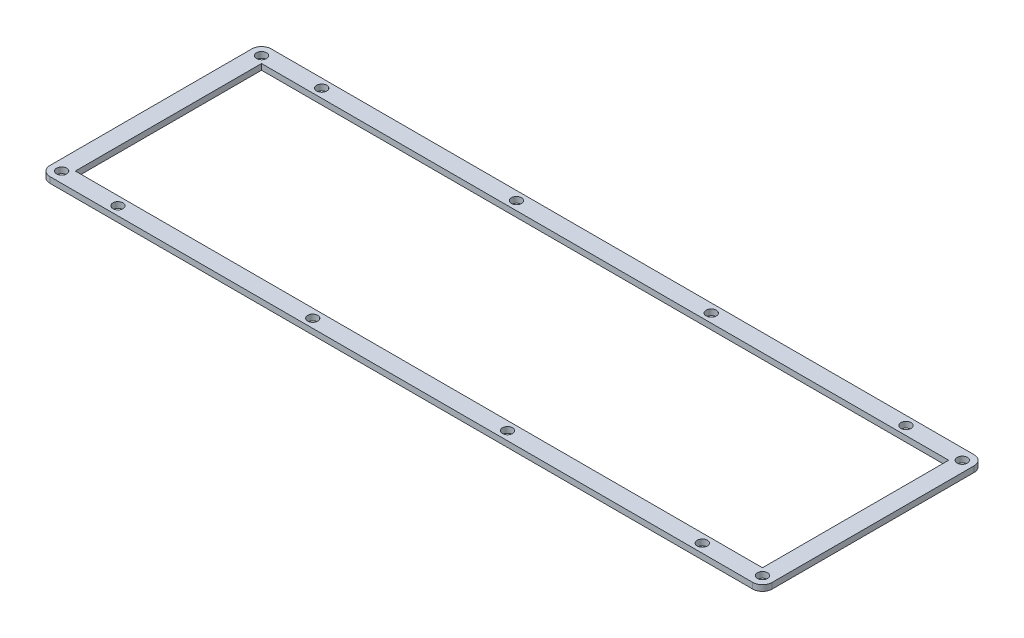
ISO-10303-21;
HEADER;
FILE_DESCRIPTION(('STEP AP214'),'2;1');
FILE_NAME('part.step','',(''),(''),'','','');
FILE_SCHEMA(('AUTOMOTIVE_DESIGN { 1 0 10303 214 1 1 1 1 }'));
ENDSEC;
DATA;
#1=APPLICATION_CONTEXT('core data for automotive mechanical design processes');
#2=APPLICATION_PROTOCOL_DEFINITION('international standard','automotive_design',2000,#1);
#3=PRODUCT_CONTEXT('',#1,'mechanical');
#4=PRODUCT('Part','Part','',(#3));
#5=PRODUCT_RELATED_PRODUCT_CATEGORY('part','',(#4));
#6=PRODUCT_DEFINITION_FORMATION('','',#4);
#7=PRODUCT_DEFINITION_CONTEXT('part definition',#1,'design');
#8=PRODUCT_DEFINITION('design','',#6,#7);
#9=PRODUCT_DEFINITION_SHAPE('','',#8);
#10=(LENGTH_UNIT() NAMED_UNIT(*) SI_UNIT(.MILLI.,.METRE.));
#11=(NAMED_UNIT(*) PLANE_ANGLE_UNIT() SI_UNIT($,.RADIAN.));
#12=(NAMED_UNIT(*) SI_UNIT($,.STERADIAN.) SOLID_ANGLE_UNIT());
#13=UNCERTAINTY_MEASURE_WITH_UNIT(LENGTH_MEASURE(1.E-05),#10,'distance_accuracy_value','');
#14=(GEOMETRIC_REPRESENTATION_CONTEXT(3) GLOBAL_UNCERTAINTY_ASSIGNED_CONTEXT((#13)) GLOBAL_UNIT_ASSIGNED_CONTEXT((#10,
#11,#12)) REPRESENTATION_CONTEXT('',''));
#15=CARTESIAN_POINT('',(0.,0.,0.));
#16=DIRECTION('',(0.,0.,1.));
#17=DIRECTION('',(1.,0.,0.));
#18=AXIS2_PLACEMENT_3D('',#15,#16,#17);
#19=CARTESIAN_POINT('',(365.775004973282,-3.,-4.9999980071498));
#20=DIRECTION('',(0.,1.,0.));
#21=DIRECTION('',(0.,0.,1.));
#22=AXIS2_PLACEMENT_3D('',#19,#20,#21);
#23=CYLINDRICAL_SURFACE('',#22,5.);
#24=CARTESIAN_POINT('',(365.775004973282,0.,-4.9999980071498));
#25=DIRECTION('',(0.,1.,0.));
#26=DIRECTION('',(0.,0.,1.));
#27=AXIS2_PLACEMENT_3D('',#24,#25,#26);
#28=CIRCLE('',#27,5.);
#29=CARTESIAN_POINT('',(365.775004973282,0.,1.99285020219264E-06));
#30=VERTEX_POINT('',#29);
#31=CARTESIAN_POINT('',(370.775004973282,0.,-4.99999800715037));
#32=VERTEX_POINT('',#31);
#33=EDGE_CURVE('E184',#30,#32,#28,.T.);
#34=ORIENTED_EDGE('',*,*,#33,.F.);
#35=DIRECTION('',(0.,1.,0.));
#36=VECTOR('',#35,1.);
#37=CARTESIAN_POINT('',(365.775004973282,-3.,1.99285020219264E-06));
#38=LINE('',#37,#36);
#39=CARTESIAN_POINT('',(365.775004973282,-3.,1.99285020219264E-06));
#40=VERTEX_POINT('',#39);
#41=EDGE_CURVE('E11',#40,#30,#38,.T.);
#42=ORIENTED_EDGE('',*,*,#41,.F.);
#43=CARTESIAN_POINT('',(365.775004973282,-3.,-4.9999980071498));
#44=DIRECTION('',(0.,1.,0.));
#45=DIRECTION('',(0.,0.,1.));
#46=AXIS2_PLACEMENT_3D('',#43,#44,#45);
#47=CIRCLE('',#46,5.);
#48=CARTESIAN_POINT('',(370.775004973282,-3.,-4.99999800715037));
#49=VERTEX_POINT('',#48);
#50=EDGE_CURVE('E187',#40,#49,#47,.T.);
#51=ORIENTED_EDGE('',*,*,#50,.T.);
#52=DIRECTION('',(0.,1.,0.));
#53=VECTOR('',#52,1.);
#54=CARTESIAN_POINT('',(370.775004973282,-3.,-4.99999800715037));
#55=LINE('',#54,#53);
#56=EDGE_CURVE('E36',#49,#32,#55,.T.);
#57=ORIENTED_EDGE('',*,*,#56,.T.);
#58=EDGE_LOOP('',(#34,#42,#51,#57));
#59=FACE_BOUND('',#58,.T.);
#60=ADVANCED_FACE('F33',(#59),#23,.T.);
#61=CARTESIAN_POINT('',(365.775004973282,-3.,1.99285020219264E-06));
#62=DIRECTION('',(0.,0.,1.));
#63=DIRECTION('',(1.,0.,0.));
#64=AXIS2_PLACEMENT_3D('',#61,#62,#63);
#65=PLANE('',#64);
#66=DIRECTION('',(1.,0.,0.));
#67=VECTOR('',#66,1.);
#68=CARTESIAN_POINT('',(365.775004973282,0.,1.99285020219264E-06));
#69=LINE('',#68,#67);
#70=CARTESIAN_POINT('',(5.00000497329483,0.,1.99284960533674E-06));
#71=VERTEX_POINT('',#70);
#72=EDGE_CURVE('E191',#71,#30,#69,.T.);
#73=ORIENTED_EDGE('',*,*,#72,.F.);
#74=DIRECTION('',(0.,1.,0.));
#75=VECTOR('',#74,1.);
#76=CARTESIAN_POINT('',(5.00000497329483,-3.,1.99284960533674E-06));
#77=LINE('',#76,#75);
#78=CARTESIAN_POINT('',(5.00000497329483,-3.,1.99284960533674E-06));
#79=VERTEX_POINT('',#78);
#80=EDGE_CURVE('E41',#79,#71,#77,.T.);
#81=ORIENTED_EDGE('',*,*,#80,.F.);
#82=DIRECTION('',(1.,0.,0.));
#83=VECTOR('',#82,1.);
#84=CARTESIAN_POINT('',(365.775004973282,-3.,1.99285020219264E-06));
#85=LINE('',#84,#83);
#86=EDGE_CURVE('E209',#79,#40,#85,.T.);
#87=ORIENTED_EDGE('',*,*,#86,.T.);
#88=ORIENTED_EDGE('',*,*,#41,.T.);
#89=EDGE_LOOP('',(#73,#81,#87,#88));
#90=FACE_BOUND('',#89,.T.);
#91=ADVANCED_FACE('F256',(#90),#65,.T.);
#92=CARTESIAN_POINT('',(5.00000497329484,-3.,-4.9999980071504));
#93=DIRECTION('',(0.,1.,0.));
#94=DIRECTION('',(0.,0.,1.));
#95=AXIS2_PLACEMENT_3D('',#92,#93,#94);
#96=CYLINDRICAL_SURFACE('',#95,5.);
#97=CARTESIAN_POINT('',(5.00000497329484,0.,-4.9999980071504));
#98=DIRECTION('',(0.,1.,0.));
#99=DIRECTION('',(0.,0.,1.));
#100=AXIS2_PLACEMENT_3D('',#97,#98,#99);
#101=CIRCLE('',#100,5.);
#102=CARTESIAN_POINT('',(4.97329483498121E-06,0.,-4.9999980071504));
#103=VERTEX_POINT('',#102);
#104=EDGE_CURVE('E229',#103,#71,#101,.T.);
#105=ORIENTED_EDGE('',*,*,#104,.F.);
#106=DIRECTION('',(0.,1.,0.));
#107=VECTOR('',#106,1.);
#108=CARTESIAN_POINT('',(4.97329483498121E-06,-3.,-4.9999980071504));
#109=LINE('',#108,#107);
#110=CARTESIAN_POINT('',(4.97329483498121E-06,-3.,-4.9999980071504));
#111=VERTEX_POINT('',#110);
#112=EDGE_CURVE('E235',#111,#103,#109,.T.);
#113=ORIENTED_EDGE('',*,*,#112,.F.);
#114=CARTESIAN_POINT('',(5.00000497329484,-3.,-4.9999980071504));
#115=DIRECTION('',(0.,1.,0.));
#116=DIRECTION('',(0.,0.,1.));
#117=AXIS2_PLACEMENT_3D('',#114,#115,#116);
#118=CIRCLE('',#117,5.);
#119=EDGE_CURVE('E206',#111,#79,#118,.T.);
#120=ORIENTED_EDGE('',*,*,#119,.T.);
#121=ORIENTED_EDGE('',*,*,#80,.T.);
#122=EDGE_LOOP('',(#105,#113,#120,#121));
#123=FACE_BOUND('',#122,.T.);
#124=ADVANCED_FACE('F276',(#123),#96,.T.);
#125=CARTESIAN_POINT('',(4.97329483462039E-06,-3.,-108.599998007137));
#126=DIRECTION('',(-1.,0.,0.));
#127=DIRECTION('',(0.,0.,1.));
#128=AXIS2_PLACEMENT_3D('',#125,#126,#127);
#129=PLANE('',#128);
#130=DIRECTION('',(0.,0.,1.));
#131=VECTOR('',#130,1.);
#132=CARTESIAN_POINT('',(4.97329483462039E-06,0.,-108.599998007137));
#133=LINE('',#132,#131);
#134=CARTESIAN_POINT('',(4.97329483462039E-06,0.,-108.599998007137));
#135=VERTEX_POINT('',#134);
#136=EDGE_CURVE('E226',#135,#103,#133,.T.);
#137=ORIENTED_EDGE('',*,*,#136,.F.);
#138=DIRECTION('',(0.,1.,0.));
#139=VECTOR('',#138,1.);
#140=CARTESIAN_POINT('',(4.97329483462039E-06,-3.,-108.599998007137));
#141=LINE('',#140,#139);
#142=CARTESIAN_POINT('',(4.97329483462039E-06,-3.,-108.599998007137));
#143=VERTEX_POINT('',#142);
#144=EDGE_CURVE('E237',#143,#135,#141,.T.);
#145=ORIENTED_EDGE('',*,*,#144,.F.);
#146=DIRECTION('',(0.,0.,1.));
#147=VECTOR('',#146,1.);
#148=CARTESIAN_POINT('',(4.97329483462039E-06,-3.,-108.599998007137));
#149=LINE('',#148,#147);
#150=EDGE_CURVE('E203',#143,#111,#149,.T.);
#151=ORIENTED_EDGE('',*,*,#150,.T.);
#152=ORIENTED_EDGE('',*,*,#112,.T.);
#153=EDGE_LOOP('',(#137,#145,#151,#152));
#154=FACE_BOUND('',#153,.T.);
#155=ADVANCED_FACE('F274',(#154),#129,.T.);
#156=CARTESIAN_POINT('',(5.00000497329484,-3.,-108.599998007137));
#157=DIRECTION('',(0.,1.,0.));
#158=DIRECTION('',(0.,0.,1.));
#159=AXIS2_PLACEMENT_3D('',#156,#157,#158);
#160=CYLINDRICAL_SURFACE('',#159,5.);
#161=CARTESIAN_POINT('',(5.00000497329484,0.,-108.599998007137));
#162=DIRECTION('',(0.,1.,0.));
#163=DIRECTION('',(0.,0.,1.));
#164=AXIS2_PLACEMENT_3D('',#161,#162,#163);
#165=CIRCLE('',#164,5.);
#166=CARTESIAN_POINT('',(5.00000497329484,0.,-113.599998007137));
#167=VERTEX_POINT('',#166);
#168=EDGE_CURVE('E223',#167,#135,#165,.T.);
#169=ORIENTED_EDGE('',*,*,#168,.F.);
#170=DIRECTION('',(0.,1.,0.));
#171=VECTOR('',#170,1.);
#172=CARTESIAN_POINT('',(5.00000497329484,-3.,-113.599998007137));
#173=LINE('',#172,#171);
#174=CARTESIAN_POINT('',(5.00000497329484,-3.,-113.599998007137));
#175=VERTEX_POINT('',#174);
#176=EDGE_CURVE('E239',#175,#167,#173,.T.);
#177=ORIENTED_EDGE('',*,*,#176,.F.);
#178=CARTESIAN_POINT('',(5.00000497329484,-3.,-108.599998007137));
#179=DIRECTION('',(0.,1.,0.));
#180=DIRECTION('',(0.,0.,1.));
#181=AXIS2_PLACEMENT_3D('',#178,#179,#180);
#182=CIRCLE('',#181,5.);
#183=EDGE_CURVE('E200',#175,#143,#182,.T.);
#184=ORIENTED_EDGE('',*,*,#183,.T.);
#185=ORIENTED_EDGE('',*,*,#144,.T.);
#186=EDGE_LOOP('',(#169,#177,#184,#185));
#187=FACE_BOUND('',#186,.T.);
#188=ADVANCED_FACE('F270',(#187),#160,.T.);
#189=CARTESIAN_POINT('',(365.775004973282,-3.,-113.599998007137));
#190=DIRECTION('',(0.,0.,-1.));
#191=DIRECTION('',(-1.,0.,0.));
#192=AXIS2_PLACEMENT_3D('',#189,#190,#191);
#193=PLANE('',#192);
#194=DIRECTION('',(-1.,0.,0.));
#195=VECTOR('',#194,1.);
#196=CARTESIAN_POINT('',(365.775004973282,0.,-113.599998007137));
#197=LINE('',#196,#195);
#198=CARTESIAN_POINT('',(365.775004973282,0.,-113.599998007137));
#199=VERTEX_POINT('',#198);
#200=EDGE_CURVE('E220',#199,#167,#197,.T.);
#201=ORIENTED_EDGE('',*,*,#200,.F.);
#202=DIRECTION('',(0.,1.,0.));
#203=VECTOR('',#202,1.);
#204=CARTESIAN_POINT('',(365.775004973282,-3.,-113.599998007137));
#205=LINE('',#204,#203);
#206=CARTESIAN_POINT('',(365.775004973282,-3.,-113.599998007137));
#207=VERTEX_POINT('',#206);
#208=EDGE_CURVE('E241',#207,#199,#205,.T.);
#209=ORIENTED_EDGE('',*,*,#208,.F.);
#210=DIRECTION('',(-1.,0.,0.));
#211=VECTOR('',#210,1.);
#212=CARTESIAN_POINT('',(365.775004973282,-3.,-113.599998007137));
#213=LINE('',#212,#211);
#214=EDGE_CURVE('E197',#207,#175,#213,.T.);
#215=ORIENTED_EDGE('',*,*,#214,.T.);
#216=ORIENTED_EDGE('',*,*,#176,.T.);
#217=EDGE_LOOP('',(#201,#209,#215,#216));
#218=FACE_BOUND('',#217,.T.);
#219=ADVANCED_FACE('F268',(#218),#193,.T.);
#220=CARTESIAN_POINT('',(365.775004973282,-3.,-108.599998007137));
#221=DIRECTION('',(0.,1.,0.));
#222=DIRECTION('',(0.,0.,1.));
#223=AXIS2_PLACEMENT_3D('',#220,#221,#222);
#224=CYLINDRICAL_SURFACE('',#223,5.);
#225=CARTESIAN_POINT('',(365.775004973282,0.,-108.599998007137));
#226=DIRECTION('',(0.,1.,0.));
#227=DIRECTION('',(0.,0.,1.));
#228=AXIS2_PLACEMENT_3D('',#225,#226,#227);
#229=CIRCLE('',#228,5.);
#230=CARTESIAN_POINT('',(370.775004973282,0.,-108.59999800715));
#231=VERTEX_POINT('',#230);
#232=EDGE_CURVE('E217',#231,#199,#229,.T.);
#233=ORIENTED_EDGE('',*,*,#232,.F.);
#234=DIRECTION('',(0.,1.,0.));
#235=VECTOR('',#234,1.);
#236=CARTESIAN_POINT('',(370.775004973282,-3.,-108.59999800715));
#237=LINE('',#236,#235);
#238=CARTESIAN_POINT('',(370.775004973282,-3.,-108.59999800715));
#239=VERTEX_POINT('',#238);
#240=EDGE_CURVE('E242',#239,#231,#237,.T.);
#241=ORIENTED_EDGE('',*,*,#240,.F.);
#242=CARTESIAN_POINT('',(365.775004973282,-3.,-108.599998007137));
#243=DIRECTION('',(0.,1.,0.));
#244=DIRECTION('',(0.,0.,1.));
#245=AXIS2_PLACEMENT_3D('',#242,#243,#244);
#246=CIRCLE('',#245,5.);
#247=EDGE_CURVE('E194',#239,#207,#246,.T.);
#248=ORIENTED_EDGE('',*,*,#247,.T.);
#249=ORIENTED_EDGE('',*,*,#208,.T.);
#250=EDGE_LOOP('',(#233,#241,#248,#249));
#251=FACE_BOUND('',#250,.T.);
#252=ADVANCED_FACE('F264',(#251),#224,.T.);
#253=CARTESIAN_POINT('',(370.775004973282,-3.,-108.59999800715));
#254=DIRECTION('',(1.,0.,0.));
#255=DIRECTION('',(0.,0.,-1.));
#256=AXIS2_PLACEMENT_3D('',#253,#254,#255);
#257=PLANE('',#256);
#258=DIRECTION('',(0.,0.,-1.));
#259=VECTOR('',#258,1.);
#260=CARTESIAN_POINT('',(370.775004973282,0.,-108.59999800715));
#261=LINE('',#260,#259);
#262=EDGE_CURVE('E214',#32,#231,#261,.T.);
#263=ORIENTED_EDGE('',*,*,#262,.F.);
#264=ORIENTED_EDGE('',*,*,#56,.F.);
#265=DIRECTION('',(0.,0.,-1.));
#266=VECTOR('',#265,1.);
#267=CARTESIAN_POINT('',(370.775004973282,-3.,-108.59999800715));
#268=LINE('',#267,#266);
#269=EDGE_CURVE('E190',#49,#239,#268,.T.);
#270=ORIENTED_EDGE('',*,*,#269,.T.);
#271=ORIENTED_EDGE('',*,*,#240,.T.);
#272=EDGE_LOOP('',(#263,#264,#270,#271));
#273=FACE_BOUND('',#272,.T.);
#274=ADVANCED_FACE('F250',(#273),#257,.T.);
#275=CARTESIAN_POINT('',(365.775004973282,-3.,-4.9999980071498));
#276=DIRECTION('',(0.,1.,0.));
#277=DIRECTION('',(0.,0.,1.));
#278=AXIS2_PLACEMENT_3D('',#275,#276,#277);
#279=PLANE('',#278);
#280=CARTESIAN_POINT('',(235.387504973288,-3.,-109.099998007125));
#281=DIRECTION('',(0.,1.,0.));
#282=DIRECTION('',(0.,0.,1.));
#283=AXIS2_PLACEMENT_3D('',#280,#281,#282);
#284=CIRCLE('',#283,2.59999999999999);
#285=CARTESIAN_POINT('',(235.387504973288,-3.,-106.499998007125));
#286=VERTEX_POINT('',#285);
#287=EDGE_CURVE('E513',#286,#286,#284,.T.);
#288=ORIENTED_EDGE('',*,*,#287,.T.);
#289=EDGE_LOOP('',(#288));
#290=FACE_BOUND('',#289,.T.);
#291=CARTESIAN_POINT('',(335.387504973288,-3.,-109.099998007127));
#292=DIRECTION('',(0.,1.,0.));
#293=DIRECTION('',(0.,0.,1.));
#294=AXIS2_PLACEMENT_3D('',#291,#292,#293);
#295=CIRCLE('',#294,2.59999999999999);
#296=CARTESIAN_POINT('',(335.387504973288,-3.,-106.499998007127));
#297=VERTEX_POINT('',#296);
#298=EDGE_CURVE('E521',#297,#297,#295,.T.);
#299=ORIENTED_EDGE('',*,*,#298,.T.);
#300=EDGE_LOOP('',(#299));
#301=FACE_BOUND('',#300,.T.);
#302=CARTESIAN_POINT('',(135.387504973288,-3.,-109.099998007123));
#303=DIRECTION('',(0.,1.,0.));
#304=DIRECTION('',(0.,0.,1.));
#305=AXIS2_PLACEMENT_3D('',#302,#303,#304);
#306=CIRCLE('',#305,2.59999999999999);
#307=CARTESIAN_POINT('',(135.387504973288,-3.,-106.499998007123));
#308=VERTEX_POINT('',#307);
#309=EDGE_CURVE('E527',#308,#308,#306,.T.);
#310=ORIENTED_EDGE('',*,*,#309,.T.);
#311=EDGE_LOOP('',(#310));
#312=FACE_BOUND('',#311,.T.);
#313=CARTESIAN_POINT('',(35.3875049732878,-3.,-109.099998007121));
#314=DIRECTION('',(0.,1.,0.));
#315=DIRECTION('',(0.,0.,1.));
#316=AXIS2_PLACEMENT_3D('',#313,#314,#315);
#317=CIRCLE('',#316,2.6);
#318=CARTESIAN_POINT('',(35.3875049732878,-3.,-106.499998007121));
#319=VERTEX_POINT('',#318);
#320=EDGE_CURVE('E533',#319,#319,#317,.T.);
#321=ORIENTED_EDGE('',*,*,#320,.T.);
#322=EDGE_LOOP('',(#321));
#323=FACE_BOUND('',#322,.T.);
#324=CARTESIAN_POINT('',(235.387504973288,-3.,-4.49999800716));
#325=DIRECTION('',(0.,1.,0.));
#326=DIRECTION('',(0.,0.,1.));
#327=AXIS2_PLACEMENT_3D('',#324,#325,#326);
#328=CIRCLE('',#327,2.59999999999999);
#329=CARTESIAN_POINT('',(235.387504973288,-3.,-1.89999800716001));
#330=VERTEX_POINT('',#329);
#331=EDGE_CURVE('E539',#330,#330,#328,.T.);
#332=ORIENTED_EDGE('',*,*,#331,.T.);
#333=EDGE_LOOP('',(#332));
#334=FACE_BOUND('',#333,.T.);
#335=CARTESIAN_POINT('',(335.387504973288,-3.,-4.49999800716));
#336=DIRECTION('',(0.,1.,0.));
#337=DIRECTION('',(0.,0.,1.));
#338=AXIS2_PLACEMENT_3D('',#335,#336,#337);
#339=CIRCLE('',#338,2.59999999999999);
#340=CARTESIAN_POINT('',(335.387504973288,-3.,-1.89999800716001));
#341=VERTEX_POINT('',#340);
#342=EDGE_CURVE('E545',#341,#341,#339,.T.);
#343=ORIENTED_EDGE('',*,*,#342,.T.);
#344=EDGE_LOOP('',(#343));
#345=FACE_BOUND('',#344,.T.);
#346=CARTESIAN_POINT('',(135.387504973289,-3.,-4.49999800716));
#347=DIRECTION('',(0.,1.,0.));
#348=DIRECTION('',(0.,0.,1.));
#349=AXIS2_PLACEMENT_3D('',#346,#347,#348);
#350=CIRCLE('',#349,2.59999999999999);
#351=CARTESIAN_POINT('',(135.387504973289,-3.,-1.89999800716001));
#352=VERTEX_POINT('',#351);
#353=EDGE_CURVE('E551',#352,#352,#350,.T.);
#354=ORIENTED_EDGE('',*,*,#353,.T.);
#355=EDGE_LOOP('',(#354));
#356=FACE_BOUND('',#355,.T.);
#357=CARTESIAN_POINT('',(35.3875049732887,-3.,-4.49999800716));
#358=DIRECTION('',(0.,1.,0.));
#359=DIRECTION('',(0.,0.,1.));
#360=AXIS2_PLACEMENT_3D('',#357,#358,#359);
#361=CIRCLE('',#360,2.6);
#362=CARTESIAN_POINT('',(35.3875049732887,-3.,-1.89999800716));
#363=VERTEX_POINT('',#362);
#364=EDGE_CURVE('E153',#363,#363,#361,.T.);
#365=ORIENTED_EDGE('',*,*,#364,.T.);
#366=EDGE_LOOP('',(#365));
#367=FACE_BOUND('',#366,.T.);
#368=DIRECTION('',(0.,0.,-1.));
#369=VECTOR('',#368,1.);
#370=CARTESIAN_POINT('',(361.775004973261,-3.,-104.599998007137));
#371=LINE('',#370,#369);
#372=CARTESIAN_POINT('',(361.775004973261,-3.,-8.9999980071504));
#373=VERTEX_POINT('',#372);
#374=CARTESIAN_POINT('',(361.775004973261,-3.,-104.599998007137));
#375=VERTEX_POINT('',#374);
#376=EDGE_CURVE('E130',#373,#375,#371,.T.);
#377=ORIENTED_EDGE('',*,*,#376,.T.);
#378=DIRECTION('',(-1.,0.,0.));
#379=VECTOR('',#378,1.);
#380=CARTESIAN_POINT('',(361.775004973261,-3.,-104.599998007137));
#381=LINE('',#380,#379);
#382=CARTESIAN_POINT('',(9.00000497329756,-3.,-104.599998007137));
#383=VERTEX_POINT('',#382);
#384=EDGE_CURVE('E124',#375,#383,#381,.T.);
#385=ORIENTED_EDGE('',*,*,#384,.T.);
#386=DIRECTION('',(0.,0.,1.));
#387=VECTOR('',#386,1.);
#388=CARTESIAN_POINT('',(9.00000497329756,-3.,-104.599998007137));
#389=LINE('',#388,#387);
#390=CARTESIAN_POINT('',(9.00000497329756,-3.,-8.9999980071504));
#391=VERTEX_POINT('',#390);
#392=EDGE_CURVE('E133',#383,#391,#389,.T.);
#393=ORIENTED_EDGE('',*,*,#392,.T.);
#394=DIRECTION('',(1.,0.,0.));
#395=VECTOR('',#394,1.);
#396=CARTESIAN_POINT('',(361.775004973261,-3.,-8.9999980071504));
#397=LINE('',#396,#395);
#398=EDGE_CURVE('E49',#391,#373,#397,.T.);
#399=ORIENTED_EDGE('',*,*,#398,.T.);
#400=EDGE_LOOP('',(#377,#385,#393,#399));
#401=FACE_BOUND('',#400,.T.);
#402=CARTESIAN_POINT('',(365.27500497328,-3.,-108.09999800715));
#403=DIRECTION('',(0.,1.,0.));
#404=DIRECTION('',(0.,0.,1.));
#405=AXIS2_PLACEMENT_3D('',#402,#403,#404);
#406=CIRCLE('',#405,2.59999999999999);
#407=CARTESIAN_POINT('',(365.27500497328,-3.,-105.49999800715));
#408=VERTEX_POINT('',#407);
#409=EDGE_CURVE('E163',#408,#408,#406,.T.);
#410=ORIENTED_EDGE('',*,*,#409,.T.);
#411=EDGE_LOOP('',(#410));
#412=FACE_BOUND('',#411,.T.);
#413=CARTESIAN_POINT('',(365.27500497328,-3.,-5.49999800714971));
#414=DIRECTION('',(0.,1.,0.));
#415=DIRECTION('',(0.,0.,1.));
#416=AXIS2_PLACEMENT_3D('',#413,#414,#415);
#417=CIRCLE('',#416,2.59999999999999);
#418=CARTESIAN_POINT('',(365.27500497328,-3.,-2.89999800714972));
#419=VERTEX_POINT('',#418);
#420=EDGE_CURVE('E169',#419,#419,#417,.T.);
#421=ORIENTED_EDGE('',*,*,#420,.T.);
#422=EDGE_LOOP('',(#421));
#423=FACE_BOUND('',#422,.T.);
#424=CARTESIAN_POINT('',(5.50000497329575,-3.,-5.49999800715028));
#425=DIRECTION('',(0.,1.,0.));
#426=DIRECTION('',(0.,0.,1.));
#427=AXIS2_PLACEMENT_3D('',#424,#425,#426);
#428=CIRCLE('',#427,2.6);
#429=CARTESIAN_POINT('',(5.50000497329575,-3.,-2.89999800715028));
#430=VERTEX_POINT('',#429);
#431=EDGE_CURVE('E175',#430,#430,#428,.T.);
#432=ORIENTED_EDGE('',*,*,#431,.T.);
#433=EDGE_LOOP('',(#432));
#434=FACE_BOUND('',#433,.T.);
#435=CARTESIAN_POINT('',(5.50000497329575,-3.,-108.099998007137));
#436=DIRECTION('',(0.,1.,0.));
#437=DIRECTION('',(0.,0.,1.));
#438=AXIS2_PLACEMENT_3D('',#435,#436,#437);
#439=CIRCLE('',#438,2.6);
#440=CARTESIAN_POINT('',(5.50000497329575,-3.,-105.499998007136));
#441=VERTEX_POINT('',#440);
#442=EDGE_CURVE('E181',#441,#441,#439,.T.);
#443=ORIENTED_EDGE('',*,*,#442,.T.);
#444=EDGE_LOOP('',(#443));
#445=FACE_BOUND('',#444,.T.);
#446=ORIENTED_EDGE('',*,*,#50,.F.);
#447=ORIENTED_EDGE('',*,*,#86,.F.);
#448=ORIENTED_EDGE('',*,*,#119,.F.);
#449=ORIENTED_EDGE('',*,*,#150,.F.);
#450=ORIENTED_EDGE('',*,*,#183,.F.);
#451=ORIENTED_EDGE('',*,*,#214,.F.);
#452=ORIENTED_EDGE('',*,*,#247,.F.);
#453=ORIENTED_EDGE('',*,*,#269,.F.);
#454=EDGE_LOOP('',(#446,#447,#448,#449,#450,#451,#452,#453));
#455=FACE_BOUND('',#454,.T.);
#456=ADVANCED_FACE('F137',(#290,#301,#312,#323,#334,#345,#356,#367,#401,#412,#423,#434,#445,
#455),#279,.F.);
#457=CARTESIAN_POINT('',(365.775004973282,0.,-4.9999980071498));
#458=DIRECTION('',(0.,1.,0.));
#459=DIRECTION('',(0.,0.,1.));
#460=AXIS2_PLACEMENT_3D('',#457,#458,#459);
#461=PLANE('',#460);
#462=CARTESIAN_POINT('',(235.387504973288,0.,-109.099998007125));
#463=DIRECTION('',(0.,1.,0.));
#464=DIRECTION('',(0.,0.,1.));
#465=AXIS2_PLACEMENT_3D('',#462,#463,#464);
#466=CIRCLE('',#465,2.59999999999999);
#467=CARTESIAN_POINT('',(235.387504973288,0.,-106.499998007125));
#468=VERTEX_POINT('',#467);
#469=EDGE_CURVE('E516',#468,#468,#466,.T.);
#470=ORIENTED_EDGE('',*,*,#469,.F.);
#471=EDGE_LOOP('',(#470));
#472=FACE_BOUND('',#471,.T.);
#473=CARTESIAN_POINT('',(335.387504973288,0.,-109.099998007127));
#474=DIRECTION('',(0.,1.,0.));
#475=DIRECTION('',(0.,0.,1.));
#476=AXIS2_PLACEMENT_3D('',#473,#474,#475);
#477=CIRCLE('',#476,2.59999999999999);
#478=CARTESIAN_POINT('',(335.387504973288,0.,-106.499998007127));
#479=VERTEX_POINT('',#478);
#480=EDGE_CURVE('E518',#479,#479,#477,.T.);
#481=ORIENTED_EDGE('',*,*,#480,.F.);
#482=EDGE_LOOP('',(#481));
#483=FACE_BOUND('',#482,.T.);
#484=CARTESIAN_POINT('',(135.387504973288,0.,-109.099998007123));
#485=DIRECTION('',(0.,1.,0.));
#486=DIRECTION('',(0.,0.,1.));
#487=AXIS2_PLACEMENT_3D('',#484,#485,#486);
#488=CIRCLE('',#487,2.59999999999999);
#489=CARTESIAN_POINT('',(135.387504973288,0.,-106.499998007123));
#490=VERTEX_POINT('',#489);
#491=EDGE_CURVE('E524',#490,#490,#488,.T.);
#492=ORIENTED_EDGE('',*,*,#491,.F.);
#493=EDGE_LOOP('',(#492));
#494=FACE_BOUND('',#493,.T.);
#495=CARTESIAN_POINT('',(35.3875049732878,0.,-109.099998007121));
#496=DIRECTION('',(0.,1.,0.));
#497=DIRECTION('',(0.,0.,1.));
#498=AXIS2_PLACEMENT_3D('',#495,#496,#497);
#499=CIRCLE('',#498,2.6);
#500=CARTESIAN_POINT('',(35.3875049732878,0.,-106.499998007121));
#501=VERTEX_POINT('',#500);
#502=EDGE_CURVE('E530',#501,#501,#499,.T.);
#503=ORIENTED_EDGE('',*,*,#502,.F.);
#504=EDGE_LOOP('',(#503));
#505=FACE_BOUND('',#504,.T.);
#506=CARTESIAN_POINT('',(235.387504973288,0.,-4.49999800716));
#507=DIRECTION('',(0.,1.,0.));
#508=DIRECTION('',(0.,0.,1.));
#509=AXIS2_PLACEMENT_3D('',#506,#507,#508);
#510=CIRCLE('',#509,2.59999999999999);
#511=CARTESIAN_POINT('',(235.387504973288,0.,-1.89999800716001));
#512=VERTEX_POINT('',#511);
#513=EDGE_CURVE('E536',#512,#512,#510,.T.);
#514=ORIENTED_EDGE('',*,*,#513,.F.);
#515=EDGE_LOOP('',(#514));
#516=FACE_BOUND('',#515,.T.);
#517=CARTESIAN_POINT('',(335.387504973288,0.,-4.49999800716));
#518=DIRECTION('',(0.,1.,0.));
#519=DIRECTION('',(0.,0.,1.));
#520=AXIS2_PLACEMENT_3D('',#517,#518,#519);
#521=CIRCLE('',#520,2.59999999999999);
#522=CARTESIAN_POINT('',(335.387504973288,0.,-1.89999800716001));
#523=VERTEX_POINT('',#522);
#524=EDGE_CURVE('E542',#523,#523,#521,.T.);
#525=ORIENTED_EDGE('',*,*,#524,.F.);
#526=EDGE_LOOP('',(#525));
#527=FACE_BOUND('',#526,.T.);
#528=CARTESIAN_POINT('',(135.387504973289,0.,-4.49999800716));
#529=DIRECTION('',(0.,1.,0.));
#530=DIRECTION('',(0.,0.,1.));
#531=AXIS2_PLACEMENT_3D('',#528,#529,#530);
#532=CIRCLE('',#531,2.59999999999999);
#533=CARTESIAN_POINT('',(135.387504973289,0.,-1.89999800716001));
#534=VERTEX_POINT('',#533);
#535=EDGE_CURVE('E548',#534,#534,#532,.T.);
#536=ORIENTED_EDGE('',*,*,#535,.F.);
#537=EDGE_LOOP('',(#536));
#538=FACE_BOUND('',#537,.T.);
#539=CARTESIAN_POINT('',(35.3875049732887,0.,-4.49999800716));
#540=DIRECTION('',(0.,1.,0.));
#541=DIRECTION('',(0.,0.,1.));
#542=AXIS2_PLACEMENT_3D('',#539,#540,#541);
#543=CIRCLE('',#542,2.6);
#544=CARTESIAN_POINT('',(35.3875049732887,0.,-1.89999800716));
#545=VERTEX_POINT('',#544);
#546=EDGE_CURVE('E146',#545,#545,#543,.T.);
#547=ORIENTED_EDGE('',*,*,#546,.F.);
#548=EDGE_LOOP('',(#547));
#549=FACE_BOUND('',#548,.T.);
#550=DIRECTION('',(-1.,0.,0.));
#551=VECTOR('',#550,1.);
#552=CARTESIAN_POINT('',(361.775004973261,0.,-104.599998007137));
#553=LINE('',#552,#551);
#554=CARTESIAN_POINT('',(361.775004973261,0.,-104.599998007137));
#555=VERTEX_POINT('',#554);
#556=CARTESIAN_POINT('',(9.00000497329756,0.,-104.599998007137));
#557=VERTEX_POINT('',#556);
#558=EDGE_CURVE('E57',#555,#557,#553,.T.);
#559=ORIENTED_EDGE('',*,*,#558,.F.);
#560=DIRECTION('',(0.,0.,-1.));
#561=VECTOR('',#560,1.);
#562=CARTESIAN_POINT('',(361.775004973261,0.,-104.599998007137));
#563=LINE('',#562,#561);
#564=CARTESIAN_POINT('',(361.775004973261,0.,-8.9999980071504));
#565=VERTEX_POINT('',#564);
#566=EDGE_CURVE('E140',#565,#555,#563,.T.);
#567=ORIENTED_EDGE('',*,*,#566,.F.);
#568=DIRECTION('',(1.,0.,0.));
#569=VECTOR('',#568,1.);
#570=CARTESIAN_POINT('',(361.775004973261,0.,-8.9999980071504));
#571=LINE('',#570,#569);
#572=CARTESIAN_POINT('',(9.00000497329756,0.,-8.9999980071504));
#573=VERTEX_POINT('',#572);
#574=EDGE_CURVE('E143',#573,#565,#571,.T.);
#575=ORIENTED_EDGE('',*,*,#574,.F.);
#576=DIRECTION('',(0.,0.,1.));
#577=VECTOR('',#576,1.);
#578=CARTESIAN_POINT('',(9.00000497329756,0.,-104.599998007137));
#579=LINE('',#578,#577);
#580=EDGE_CURVE('E152',#557,#573,#579,.T.);
#581=ORIENTED_EDGE('',*,*,#580,.F.);
#582=EDGE_LOOP('',(#559,#567,#575,#581));
#583=FACE_BOUND('',#582,.T.);
#584=CARTESIAN_POINT('',(365.27500497328,0.,-108.09999800715));
#585=DIRECTION('',(0.,1.,0.));
#586=DIRECTION('',(0.,0.,1.));
#587=AXIS2_PLACEMENT_3D('',#584,#585,#586);
#588=CIRCLE('',#587,2.59999999999999);
#589=CARTESIAN_POINT('',(365.27500497328,0.,-105.49999800715));
#590=VERTEX_POINT('',#589);
#591=EDGE_CURVE('E159',#590,#590,#588,.T.);
#592=ORIENTED_EDGE('',*,*,#591,.F.);
#593=EDGE_LOOP('',(#592));
#594=FACE_BOUND('',#593,.T.);
#595=CARTESIAN_POINT('',(365.27500497328,0.,-5.49999800714971));
#596=DIRECTION('',(0.,1.,0.));
#597=DIRECTION('',(0.,0.,1.));
#598=AXIS2_PLACEMENT_3D('',#595,#596,#597);
#599=CIRCLE('',#598,2.59999999999999);
#600=CARTESIAN_POINT('',(365.27500497328,0.,-2.89999800714972));
#601=VERTEX_POINT('',#600);
#602=EDGE_CURVE('E166',#601,#601,#599,.T.);
#603=ORIENTED_EDGE('',*,*,#602,.F.);
#604=EDGE_LOOP('',(#603));
#605=FACE_BOUND('',#604,.T.);
#606=CARTESIAN_POINT('',(5.50000497329575,0.,-5.49999800715028));
#607=DIRECTION('',(0.,1.,0.));
#608=DIRECTION('',(0.,0.,1.));
#609=AXIS2_PLACEMENT_3D('',#606,#607,#608);
#610=CIRCLE('',#609,2.6);
#611=CARTESIAN_POINT('',(5.50000497329575,0.,-2.89999800715028));
#612=VERTEX_POINT('',#611);
#613=EDGE_CURVE('E172',#612,#612,#610,.T.);
#614=ORIENTED_EDGE('',*,*,#613,.F.);
#615=EDGE_LOOP('',(#614));
#616=FACE_BOUND('',#615,.T.);
#617=CARTESIAN_POINT('',(5.50000497329575,0.,-108.099998007137));
#618=DIRECTION('',(0.,1.,0.));
#619=DIRECTION('',(0.,0.,1.));
#620=AXIS2_PLACEMENT_3D('',#617,#618,#619);
#621=CIRCLE('',#620,2.6);
#622=CARTESIAN_POINT('',(5.50000497329575,0.,-105.499998007136));
#623=VERTEX_POINT('',#622);
#624=EDGE_CURVE('E178',#623,#623,#621,.T.);
#625=ORIENTED_EDGE('',*,*,#624,.F.);
#626=EDGE_LOOP('',(#625));
#627=FACE_BOUND('',#626,.T.);
#628=ORIENTED_EDGE('',*,*,#33,.T.);
#629=ORIENTED_EDGE('',*,*,#262,.T.);
#630=ORIENTED_EDGE('',*,*,#232,.T.);
#631=ORIENTED_EDGE('',*,*,#200,.T.);
#632=ORIENTED_EDGE('',*,*,#168,.T.);
#633=ORIENTED_EDGE('',*,*,#136,.T.);
#634=ORIENTED_EDGE('',*,*,#104,.T.);
#635=ORIENTED_EDGE('',*,*,#72,.T.);
#636=EDGE_LOOP('',(#628,#629,#630,#631,#632,#633,#634,#635));
#637=FACE_BOUND('',#636,.T.);
#638=ADVANCED_FACE('F252',(#472,#483,#494,#505,#516,#527,#538,#549,#583,#594,#605,#616,#627,
#637),#461,.T.);
#639=CARTESIAN_POINT('',(5.50000497329575,-3.,-108.099998007137));
#640=DIRECTION('',(0.,1.,0.));
#641=DIRECTION('',(0.,0.,1.));
#642=AXIS2_PLACEMENT_3D('',#639,#640,#641);
#643=CYLINDRICAL_SURFACE('',#642,2.6);
#644=ORIENTED_EDGE('',*,*,#442,.F.);
#645=EDGE_LOOP('',(#644));
#646=FACE_BOUND('',#645,.T.);
#647=ORIENTED_EDGE('',*,*,#624,.T.);
#648=EDGE_LOOP('',(#647));
#649=FACE_BOUND('',#648,.T.);
#650=ADVANCED_FACE('F351',(#646,#649),#643,.F.);
#651=CARTESIAN_POINT('',(5.50000497329575,-3.,-5.49999800715028));
#652=DIRECTION('',(0.,1.,0.));
#653=DIRECTION('',(0.,0.,1.));
#654=AXIS2_PLACEMENT_3D('',#651,#652,#653);
#655=CYLINDRICAL_SURFACE('',#654,2.6);
#656=ORIENTED_EDGE('',*,*,#431,.F.);
#657=EDGE_LOOP('',(#656));
#658=FACE_BOUND('',#657,.T.);
#659=ORIENTED_EDGE('',*,*,#613,.T.);
#660=EDGE_LOOP('',(#659));
#661=FACE_BOUND('',#660,.T.);
#662=ADVANCED_FACE('F361',(#658,#661),#655,.F.);
#663=CARTESIAN_POINT('',(365.27500497328,-3.,-5.49999800714971));
#664=DIRECTION('',(0.,1.,0.));
#665=DIRECTION('',(0.,0.,1.));
#666=AXIS2_PLACEMENT_3D('',#663,#664,#665);
#667=CYLINDRICAL_SURFACE('',#666,2.59999999999999);
#668=ORIENTED_EDGE('',*,*,#420,.F.);
#669=EDGE_LOOP('',(#668));
#670=FACE_BOUND('',#669,.T.);
#671=ORIENTED_EDGE('',*,*,#602,.T.);
#672=EDGE_LOOP('',(#671));
#673=FACE_BOUND('',#672,.T.);
#674=ADVANCED_FACE('F371',(#670,#673),#667,.F.);
#675=CARTESIAN_POINT('',(365.27500497328,-3.,-108.09999800715));
#676=DIRECTION('',(0.,1.,0.));
#677=DIRECTION('',(0.,0.,1.));
#678=AXIS2_PLACEMENT_3D('',#675,#676,#677);
#679=CYLINDRICAL_SURFACE('',#678,2.59999999999999);
#680=ORIENTED_EDGE('',*,*,#409,.F.);
#681=EDGE_LOOP('',(#680));
#682=FACE_BOUND('',#681,.T.);
#683=ORIENTED_EDGE('',*,*,#591,.T.);
#684=EDGE_LOOP('',(#683));
#685=FACE_BOUND('',#684,.T.);
#686=ADVANCED_FACE('F381',(#682,#685),#679,.F.);
#687=CARTESIAN_POINT('',(361.775004973261,-3.,-104.599998007137));
#688=DIRECTION('',(0.,0.,-1.));
#689=DIRECTION('',(-1.,0.,0.));
#690=AXIS2_PLACEMENT_3D('',#687,#688,#689);
#691=PLANE('',#690);
#692=ORIENTED_EDGE('',*,*,#558,.T.);
#693=DIRECTION('',(0.,1.,0.));
#694=VECTOR('',#693,1.);
#695=CARTESIAN_POINT('',(9.00000497329756,-3.,-104.599998007137));
#696=LINE('',#695,#694);
#697=EDGE_CURVE('E120',#383,#557,#696,.T.);
#698=ORIENTED_EDGE('',*,*,#697,.F.);
#699=ORIENTED_EDGE('',*,*,#384,.F.);
#700=DIRECTION('',(0.,1.,0.));
#701=VECTOR('',#700,1.);
#702=CARTESIAN_POINT('',(361.775004973261,-3.,-104.599998007137));
#703=LINE('',#702,#701);
#704=EDGE_CURVE('E157',#375,#555,#703,.T.);
#705=ORIENTED_EDGE('',*,*,#704,.T.);
#706=EDGE_LOOP('',(#692,#698,#699,#705));
#707=FACE_BOUND('',#706,.T.);
#708=ADVANCED_FACE('F122',(#707),#691,.F.);
#709=CARTESIAN_POINT('',(361.775004973261,-3.,-104.599998007137));
#710=DIRECTION('',(1.,0.,0.));
#711=DIRECTION('',(0.,0.,-1.));
#712=AXIS2_PLACEMENT_3D('',#709,#710,#711);
#713=PLANE('',#712);
#714=ORIENTED_EDGE('',*,*,#566,.T.);
#715=ORIENTED_EDGE('',*,*,#704,.F.);
#716=ORIENTED_EDGE('',*,*,#376,.F.);
#717=DIRECTION('',(0.,1.,0.));
#718=VECTOR('',#717,1.);
#719=CARTESIAN_POINT('',(361.775004973261,-3.,-8.9999980071504));
#720=LINE('',#719,#718);
#721=EDGE_CURVE('E160',#373,#565,#720,.T.);
#722=ORIENTED_EDGE('',*,*,#721,.T.);
#723=EDGE_LOOP('',(#714,#715,#716,#722));
#724=FACE_BOUND('',#723,.T.);
#725=ADVANCED_FACE('F400',(#724),#713,.F.);
#726=CARTESIAN_POINT('',(361.775004973261,-3.,-8.9999980071504));
#727=DIRECTION('',(0.,0.,1.));
#728=DIRECTION('',(1.,0.,0.));
#729=AXIS2_PLACEMENT_3D('',#726,#727,#728);
#730=PLANE('',#729);
#731=ORIENTED_EDGE('',*,*,#574,.T.);
#732=ORIENTED_EDGE('',*,*,#721,.F.);
#733=ORIENTED_EDGE('',*,*,#398,.F.);
#734=DIRECTION('',(0.,1.,0.));
#735=VECTOR('',#734,1.);
#736=CARTESIAN_POINT('',(9.00000497329756,-3.,-8.9999980071504));
#737=LINE('',#736,#735);
#738=EDGE_CURVE('E129',#391,#573,#737,.T.);
#739=ORIENTED_EDGE('',*,*,#738,.T.);
#740=EDGE_LOOP('',(#731,#732,#733,#739));
#741=FACE_BOUND('',#740,.T.);
#742=ADVANCED_FACE('F409',(#741),#730,.F.);
#743=CARTESIAN_POINT('',(9.00000497329756,-3.,-104.599998007137));
#744=DIRECTION('',(-1.,0.,0.));
#745=DIRECTION('',(0.,0.,1.));
#746=AXIS2_PLACEMENT_3D('',#743,#744,#745);
#747=PLANE('',#746);
#748=ORIENTED_EDGE('',*,*,#580,.T.);
#749=ORIENTED_EDGE('',*,*,#738,.F.);
#750=ORIENTED_EDGE('',*,*,#392,.F.);
#751=ORIENTED_EDGE('',*,*,#697,.T.);
#752=EDGE_LOOP('',(#748,#749,#750,#751));
#753=FACE_BOUND('',#752,.T.);
#754=ADVANCED_FACE('F134',(#753),#747,.F.);
#755=CARTESIAN_POINT('',(35.3875049732887,-3.,-4.49999800716));
#756=DIRECTION('',(0.,1.,0.));
#757=DIRECTION('',(0.,0.,1.));
#758=AXIS2_PLACEMENT_3D('',#755,#756,#757);
#759=CYLINDRICAL_SURFACE('',#758,2.6);
#760=ORIENTED_EDGE('',*,*,#364,.F.);
#761=EDGE_LOOP('',(#760));
#762=FACE_BOUND('',#761,.T.);
#763=ORIENTED_EDGE('',*,*,#546,.T.);
#764=EDGE_LOOP('',(#763));
#765=FACE_BOUND('',#764,.T.);
#766=ADVANCED_FACE('F427',(#762,#765),#759,.F.);
#767=CARTESIAN_POINT('',(135.387504973289,-3.,-4.49999800716));
#768=DIRECTION('',(0.,1.,0.));
#769=DIRECTION('',(0.,0.,1.));
#770=AXIS2_PLACEMENT_3D('',#767,#768,#769);
#771=CYLINDRICAL_SURFACE('',#770,2.59999999999999);
#772=ORIENTED_EDGE('',*,*,#353,.F.);
#773=EDGE_LOOP('',(#772));
#774=FACE_BOUND('',#773,.T.);
#775=ORIENTED_EDGE('',*,*,#535,.T.);
#776=EDGE_LOOP('',(#775));
#777=FACE_BOUND('',#776,.T.);
#778=ADVANCED_FACE('F436',(#774,#777),#771,.F.);
#779=CARTESIAN_POINT('',(335.387504973288,-3.,-4.49999800716));
#780=DIRECTION('',(0.,1.,0.));
#781=DIRECTION('',(0.,0.,1.));
#782=AXIS2_PLACEMENT_3D('',#779,#780,#781);
#783=CYLINDRICAL_SURFACE('',#782,2.59999999999999);
#784=ORIENTED_EDGE('',*,*,#342,.F.);
#785=EDGE_LOOP('',(#784));
#786=FACE_BOUND('',#785,.T.);
#787=ORIENTED_EDGE('',*,*,#524,.T.);
#788=EDGE_LOOP('',(#787));
#789=FACE_BOUND('',#788,.T.);
#790=ADVANCED_FACE('F446',(#786,#789),#783,.F.);
#791=CARTESIAN_POINT('',(235.387504973288,-3.,-4.49999800716));
#792=DIRECTION('',(0.,1.,0.));
#793=DIRECTION('',(0.,0.,1.));
#794=AXIS2_PLACEMENT_3D('',#791,#792,#793);
#795=CYLINDRICAL_SURFACE('',#794,2.59999999999999);
#796=ORIENTED_EDGE('',*,*,#331,.F.);
#797=EDGE_LOOP('',(#796));
#798=FACE_BOUND('',#797,.T.);
#799=ORIENTED_EDGE('',*,*,#513,.T.);
#800=EDGE_LOOP('',(#799));
#801=FACE_BOUND('',#800,.T.);
#802=ADVANCED_FACE('F456',(#798,#801),#795,.F.);
#803=CARTESIAN_POINT('',(35.3875049732878,-3.,-109.099998007121));
#804=DIRECTION('',(0.,1.,0.));
#805=DIRECTION('',(0.,0.,1.));
#806=AXIS2_PLACEMENT_3D('',#803,#804,#805);
#807=CYLINDRICAL_SURFACE('',#806,2.6);
#808=ORIENTED_EDGE('',*,*,#320,.F.);
#809=EDGE_LOOP('',(#808));
#810=FACE_BOUND('',#809,.T.);
#811=ORIENTED_EDGE('',*,*,#502,.T.);
#812=EDGE_LOOP('',(#811));
#813=FACE_BOUND('',#812,.T.);
#814=ADVANCED_FACE('F466',(#810,#813),#807,.F.);
#815=CARTESIAN_POINT('',(135.387504973288,-3.,-109.099998007123));
#816=DIRECTION('',(0.,1.,0.));
#817=DIRECTION('',(0.,0.,1.));
#818=AXIS2_PLACEMENT_3D('',#815,#816,#817);
#819=CYLINDRICAL_SURFACE('',#818,2.59999999999999);
#820=ORIENTED_EDGE('',*,*,#309,.F.);
#821=EDGE_LOOP('',(#820));
#822=FACE_BOUND('',#821,.T.);
#823=ORIENTED_EDGE('',*,*,#491,.T.);
#824=EDGE_LOOP('',(#823));
#825=FACE_BOUND('',#824,.T.);
#826=ADVANCED_FACE('F476',(#822,#825),#819,.F.);
#827=CARTESIAN_POINT('',(335.387504973288,-3.,-109.099998007127));
#828=DIRECTION('',(0.,1.,0.));
#829=DIRECTION('',(0.,0.,1.));
#830=AXIS2_PLACEMENT_3D('',#827,#828,#829);
#831=CYLINDRICAL_SURFACE('',#830,2.59999999999999);
#832=ORIENTED_EDGE('',*,*,#298,.F.);
#833=EDGE_LOOP('',(#832));
#834=FACE_BOUND('',#833,.T.);
#835=ORIENTED_EDGE('',*,*,#480,.T.);
#836=EDGE_LOOP('',(#835));
#837=FACE_BOUND('',#836,.T.);
#838=ADVANCED_FACE('F486',(#834,#837),#831,.F.);
#839=CARTESIAN_POINT('',(235.387504973288,-3.,-109.099998007125));
#840=DIRECTION('',(0.,1.,0.));
#841=DIRECTION('',(0.,0.,1.));
#842=AXIS2_PLACEMENT_3D('',#839,#840,#841);
#843=CYLINDRICAL_SURFACE('',#842,2.59999999999999);
#844=ORIENTED_EDGE('',*,*,#287,.F.);
#845=EDGE_LOOP('',(#844));
#846=FACE_BOUND('',#845,.T.);
#847=ORIENTED_EDGE('',*,*,#469,.T.);
#848=EDGE_LOOP('',(#847));
#849=FACE_BOUND('',#848,.T.);
#850=ADVANCED_FACE('F496',(#846,#849),#843,.F.);
#851=CLOSED_SHELL('',(#60,#91,#124,#155,#188,#219,#252,#274,#456,#638,#650,#662,#674,#686,#708,
#725,#742,#754,#766,#778,#790,#802,#814,#826,#838,#850));
#852=MANIFOLD_SOLID_BREP('B2',#851);
#853=ADVANCED_BREP_SHAPE_REPRESENTATION('',(#18,#852),#14);
#854=SHAPE_DEFINITION_REPRESENTATION(#9,#853);
ENDSEC;
END-ISO-10303-21;
